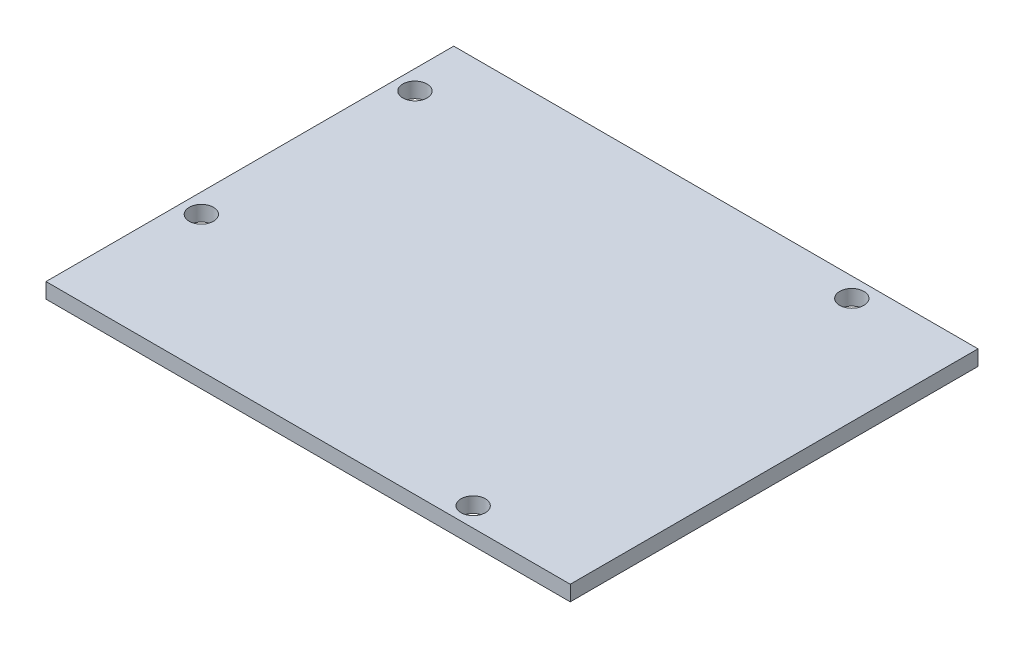
ISO-10303-21;
HEADER;
FILE_DESCRIPTION(('STEP AP214'),'2;1');
FILE_NAME('part.step','',(''),(''),'','','');
FILE_SCHEMA(('AUTOMOTIVE_DESIGN { 1 0 10303 214 1 1 1 1 }'));
ENDSEC;
DATA;
#1=APPLICATION_CONTEXT('core data for automotive mechanical design processes');
#2=APPLICATION_PROTOCOL_DEFINITION('international standard','automotive_design',2000,#1);
#3=PRODUCT_CONTEXT('',#1,'mechanical');
#4=PRODUCT('Part','Part','',(#3));
#5=PRODUCT_RELATED_PRODUCT_CATEGORY('part','',(#4));
#6=PRODUCT_DEFINITION_FORMATION('','',#4);
#7=PRODUCT_DEFINITION_CONTEXT('part definition',#1,'design');
#8=PRODUCT_DEFINITION('design','',#6,#7);
#9=PRODUCT_DEFINITION_SHAPE('','',#8);
#10=(LENGTH_UNIT() NAMED_UNIT(*) SI_UNIT(.MILLI.,.METRE.));
#11=(NAMED_UNIT(*) PLANE_ANGLE_UNIT() SI_UNIT($,.RADIAN.));
#12=(NAMED_UNIT(*) SI_UNIT($,.STERADIAN.) SOLID_ANGLE_UNIT());
#13=UNCERTAINTY_MEASURE_WITH_UNIT(LENGTH_MEASURE(1.E-05),#10,'distance_accuracy_value','');
#14=(GEOMETRIC_REPRESENTATION_CONTEXT(3) GLOBAL_UNCERTAINTY_ASSIGNED_CONTEXT((#13)) GLOBAL_UNIT_ASSIGNED_CONTEXT((#10,
#11,#12)) REPRESENTATION_CONTEXT('',''));
#15=CARTESIAN_POINT('',(0.,0.,0.));
#16=DIRECTION('',(0.,0.,1.));
#17=DIRECTION('',(1.,0.,0.));
#18=AXIS2_PLACEMENT_3D('',#15,#16,#17);
#19=CARTESIAN_POINT('',(0.,2.,0.));
#20=DIRECTION('',(0.,1.,0.));
#21=DIRECTION('',(0.,0.,1.));
#22=AXIS2_PLACEMENT_3D('',#19,#20,#21);
#23=PLANE('',#22);
#24=CARTESIAN_POINT('',(52.8104629581221,2.,-2.39173328178488));
#25=DIRECTION('',(0.,1.,0.));
#26=DIRECTION('',(0.,0.,1.));
#27=AXIS2_PLACEMENT_3D('',#24,#25,#26);
#28=CIRCLE('',#27,1.5875);
#29=CARTESIAN_POINT('',(52.8104629581221,2.,-0.80423328178488));
#30=VERTEX_POINT('',#29);
#31=EDGE_CURVE('E125',#30,#30,#28,.T.);
#32=ORIENTED_EDGE('',*,*,#31,.F.);
#33=EDGE_LOOP('',(#32));
#34=FACE_BOUND('',#33,.T.);
#35=CARTESIAN_POINT('',(2.01046295812209,2.,-17.6317332817849));
#36=DIRECTION('',(0.,1.,0.));
#37=DIRECTION('',(0.,0.,1.));
#38=AXIS2_PLACEMENT_3D('',#35,#36,#37);
#39=CIRCLE('',#38,1.5875);
#40=CARTESIAN_POINT('',(2.01046295812209,2.,-16.0442332817849));
#41=VERTEX_POINT('',#40);
#42=EDGE_CURVE('E104',#41,#41,#39,.T.);
#43=ORIENTED_EDGE('',*,*,#42,.F.);
#44=EDGE_LOOP('',(#43));
#45=FACE_BOUND('',#44,.T.);
#46=DIRECTION('',(0.,0.,1.));
#47=VECTOR('',#46,1.);
#48=CARTESIAN_POINT('',(-0.529537041877912,2.,-53.1917332817849));
#49=LINE('',#48,#47);
#50=CARTESIAN_POINT('',(-0.529537041877912,2.,-53.1917332817849));
#51=VERTEX_POINT('',#50);
#52=CARTESIAN_POINT('',(-0.529537041877906,2.,0.148266718215121));
#53=VERTEX_POINT('',#52);
#54=EDGE_CURVE('E89',#51,#53,#49,.T.);
#55=ORIENTED_EDGE('',*,*,#54,.T.);
#56=DIRECTION('',(1.,0.,0.));
#57=VECTOR('',#56,1.);
#58=CARTESIAN_POINT('',(-0.529537041877906,2.,0.148266718215121));
#59=LINE('',#58,#57);
#60=CARTESIAN_POINT('',(68.0504629581221,2.,0.148266718215121));
#61=VERTEX_POINT('',#60);
#62=EDGE_CURVE('E84',#53,#61,#59,.T.);
#63=ORIENTED_EDGE('',*,*,#62,.T.);
#64=DIRECTION('',(0.,0.,-1.));
#65=VECTOR('',#64,1.);
#66=CARTESIAN_POINT('',(68.0504629581221,2.,-53.1917332817849));
#67=LINE('',#66,#65);
#68=CARTESIAN_POINT('',(68.0504629581221,2.,-53.1917332817849));
#69=VERTEX_POINT('',#68);
#70=EDGE_CURVE('E87',#61,#69,#67,.T.);
#71=ORIENTED_EDGE('',*,*,#70,.T.);
#72=DIRECTION('',(-1.,0.,0.));
#73=VECTOR('',#72,1.);
#74=CARTESIAN_POINT('',(-0.529537041877912,2.,-53.1917332817849));
#75=LINE('',#74,#73);
#76=EDGE_CURVE('E54',#69,#51,#75,.T.);
#77=ORIENTED_EDGE('',*,*,#76,.T.);
#78=EDGE_LOOP('',(#55,#63,#71,#77));
#79=FACE_BOUND('',#78,.T.);
#80=CARTESIAN_POINT('',(2.01046295812209,2.,-45.5717332817849));
#81=DIRECTION('',(0.,1.,0.));
#82=DIRECTION('',(0.,0.,1.));
#83=AXIS2_PLACEMENT_3D('',#80,#81,#82);
#84=CIRCLE('',#83,1.5875);
#85=CARTESIAN_POINT('',(2.01046295812209,2.,-43.9842332817849));
#86=VERTEX_POINT('',#85);
#87=EDGE_CURVE('E119',#86,#86,#84,.T.);
#88=ORIENTED_EDGE('',*,*,#87,.F.);
#89=EDGE_LOOP('',(#88));
#90=FACE_BOUND('',#89,.T.);
#91=CARTESIAN_POINT('',(54.0804629581221,2.,-50.6517332817849));
#92=DIRECTION('',(0.,1.,0.));
#93=DIRECTION('',(0.,0.,1.));
#94=AXIS2_PLACEMENT_3D('',#91,#92,#93);
#95=CIRCLE('',#94,1.5875);
#96=CARTESIAN_POINT('',(54.0804629581221,2.,-49.0642332817849));
#97=VERTEX_POINT('',#96);
#98=EDGE_CURVE('E131',#97,#97,#95,.T.);
#99=ORIENTED_EDGE('',*,*,#98,.F.);
#100=EDGE_LOOP('',(#99));
#101=FACE_BOUND('',#100,.T.);
#102=ADVANCED_FACE('F37',(#34,#45,#79,#90,#101),#23,.T.);
#103=CARTESIAN_POINT('',(0.,0.,0.));
#104=DIRECTION('',(0.,1.,0.));
#105=DIRECTION('',(0.,0.,1.));
#106=AXIS2_PLACEMENT_3D('',#103,#104,#105);
#107=PLANE('',#106);
#108=DIRECTION('',(0.,0.,1.));
#109=VECTOR('',#108,1.);
#110=CARTESIAN_POINT('',(-0.529537041877912,0.,-53.1917332817849));
#111=LINE('',#110,#109);
#112=CARTESIAN_POINT('',(-0.529537041877912,0.,-53.1917332817849));
#113=VERTEX_POINT('',#112);
#114=CARTESIAN_POINT('',(-0.529537041877906,0.,0.148266718215121));
#115=VERTEX_POINT('',#114);
#116=EDGE_CURVE('E101',#113,#115,#111,.T.);
#117=ORIENTED_EDGE('',*,*,#116,.F.);
#118=DIRECTION('',(-1.,0.,0.));
#119=VECTOR('',#118,1.);
#120=CARTESIAN_POINT('',(-0.529537041877912,0.,-53.1917332817849));
#121=LINE('',#120,#119);
#122=CARTESIAN_POINT('',(68.0504629581221,0.,-53.1917332817849));
#123=VERTEX_POINT('',#122);
#124=EDGE_CURVE('E77',#123,#113,#121,.T.);
#125=ORIENTED_EDGE('',*,*,#124,.F.);
#126=DIRECTION('',(0.,0.,-1.));
#127=VECTOR('',#126,1.);
#128=CARTESIAN_POINT('',(68.0504629581221,0.,-53.1917332817849));
#129=LINE('',#128,#127);
#130=CARTESIAN_POINT('',(68.0504629581221,0.,0.148266718215121));
#131=VERTEX_POINT('',#130);
#132=EDGE_CURVE('E71',#131,#123,#129,.T.);
#133=ORIENTED_EDGE('',*,*,#132,.F.);
#134=DIRECTION('',(1.,0.,0.));
#135=VECTOR('',#134,1.);
#136=CARTESIAN_POINT('',(-0.529537041877906,0.,0.148266718215121));
#137=LINE('',#136,#135);
#138=EDGE_CURVE('E93',#115,#131,#137,.T.);
#139=ORIENTED_EDGE('',*,*,#138,.F.);
#140=EDGE_LOOP('',(#117,#125,#133,#139));
#141=FACE_BOUND('',#140,.T.);
#142=CARTESIAN_POINT('',(2.01046295812209,0.,-17.6317332817849));
#143=DIRECTION('',(0.,1.,0.));
#144=DIRECTION('',(0.,0.,1.));
#145=AXIS2_PLACEMENT_3D('',#142,#143,#144);
#146=CIRCLE('',#145,1.5875);
#147=CARTESIAN_POINT('',(2.01046295812209,0.,-16.0442332817849));
#148=VERTEX_POINT('',#147);
#149=EDGE_CURVE('E116',#148,#148,#146,.T.);
#150=ORIENTED_EDGE('',*,*,#149,.T.);
#151=EDGE_LOOP('',(#150));
#152=FACE_BOUND('',#151,.T.);
#153=CARTESIAN_POINT('',(2.01046295812209,0.,-45.5717332817849));
#154=DIRECTION('',(0.,1.,0.));
#155=DIRECTION('',(0.,0.,1.));
#156=AXIS2_PLACEMENT_3D('',#153,#154,#155);
#157=CIRCLE('',#156,1.5875);
#158=CARTESIAN_POINT('',(2.01046295812209,0.,-43.9842332817849));
#159=VERTEX_POINT('',#158);
#160=EDGE_CURVE('E122',#159,#159,#157,.T.);
#161=ORIENTED_EDGE('',*,*,#160,.T.);
#162=EDGE_LOOP('',(#161));
#163=FACE_BOUND('',#162,.T.);
#164=CARTESIAN_POINT('',(52.8104629581221,0.,-2.39173328178488));
#165=DIRECTION('',(0.,1.,0.));
#166=DIRECTION('',(0.,0.,1.));
#167=AXIS2_PLACEMENT_3D('',#164,#165,#166);
#168=CIRCLE('',#167,1.5875);
#169=CARTESIAN_POINT('',(52.8104629581221,0.,-0.80423328178488));
#170=VERTEX_POINT('',#169);
#171=EDGE_CURVE('E128',#170,#170,#168,.T.);
#172=ORIENTED_EDGE('',*,*,#171,.T.);
#173=EDGE_LOOP('',(#172));
#174=FACE_BOUND('',#173,.T.);
#175=CARTESIAN_POINT('',(54.0804629581221,0.,-50.6517332817849));
#176=DIRECTION('',(0.,1.,0.));
#177=DIRECTION('',(0.,0.,1.));
#178=AXIS2_PLACEMENT_3D('',#175,#176,#177);
#179=CIRCLE('',#178,1.5875);
#180=CARTESIAN_POINT('',(54.0804629581221,0.,-49.0642332817849));
#181=VERTEX_POINT('',#180);
#182=EDGE_CURVE('E134',#181,#181,#179,.T.);
#183=ORIENTED_EDGE('',*,*,#182,.T.);
#184=EDGE_LOOP('',(#183));
#185=FACE_BOUND('',#184,.T.);
#186=ADVANCED_FACE('F112',(#141,#152,#163,#174,#185),#107,.F.);
#187=CARTESIAN_POINT('',(-0.529537041877912,2.,-53.1917332817849));
#188=DIRECTION('',(1.,0.,0.));
#189=DIRECTION('',(0.,0.,-1.));
#190=AXIS2_PLACEMENT_3D('',#187,#188,#189);
#191=PLANE('',#190);
#192=ORIENTED_EDGE('',*,*,#116,.T.);
#193=DIRECTION('',(0.,-1.,0.));
#194=VECTOR('',#193,1.);
#195=CARTESIAN_POINT('',(-0.529537041877906,2.,0.148266718215121));
#196=LINE('',#195,#194);
#197=EDGE_CURVE('E11',#53,#115,#196,.T.);
#198=ORIENTED_EDGE('',*,*,#197,.F.);
#199=ORIENTED_EDGE('',*,*,#54,.F.);
#200=DIRECTION('',(0.,-1.,0.));
#201=VECTOR('',#200,1.);
#202=CARTESIAN_POINT('',(-0.529537041877912,2.,-53.1917332817849));
#203=LINE('',#202,#201);
#204=EDGE_CURVE('E97',#51,#113,#203,.T.);
#205=ORIENTED_EDGE('',*,*,#204,.T.);
#206=EDGE_LOOP('',(#192,#198,#199,#205));
#207=FACE_BOUND('',#206,.T.);
#208=ADVANCED_FACE('F39',(#207),#191,.F.);
#209=CARTESIAN_POINT('',(-0.529537041877906,2.,0.148266718215121));
#210=DIRECTION('',(0.,0.,-1.));
#211=DIRECTION('',(-1.,0.,0.));
#212=AXIS2_PLACEMENT_3D('',#209,#210,#211);
#213=PLANE('',#212);
#214=ORIENTED_EDGE('',*,*,#138,.T.);
#215=DIRECTION('',(0.,-1.,0.));
#216=VECTOR('',#215,1.);
#217=CARTESIAN_POINT('',(68.0504629581221,2.,0.148266718215121));
#218=LINE('',#217,#216);
#219=EDGE_CURVE('E46',#61,#131,#218,.T.);
#220=ORIENTED_EDGE('',*,*,#219,.F.);
#221=ORIENTED_EDGE('',*,*,#62,.F.);
#222=ORIENTED_EDGE('',*,*,#197,.T.);
#223=EDGE_LOOP('',(#214,#220,#221,#222));
#224=FACE_BOUND('',#223,.T.);
#225=ADVANCED_FACE('F92',(#224),#213,.F.);
#226=CARTESIAN_POINT('',(68.0504629581221,2.,-53.1917332817849));
#227=DIRECTION('',(-1.,0.,0.));
#228=DIRECTION('',(0.,0.,1.));
#229=AXIS2_PLACEMENT_3D('',#226,#227,#228);
#230=PLANE('',#229);
#231=ORIENTED_EDGE('',*,*,#132,.T.);
#232=DIRECTION('',(0.,-1.,0.));
#233=VECTOR('',#232,1.);
#234=CARTESIAN_POINT('',(68.0504629581221,2.,-53.1917332817849));
#235=LINE('',#234,#233);
#236=EDGE_CURVE('E94',#69,#123,#235,.T.);
#237=ORIENTED_EDGE('',*,*,#236,.F.);
#238=ORIENTED_EDGE('',*,*,#70,.F.);
#239=ORIENTED_EDGE('',*,*,#219,.T.);
#240=EDGE_LOOP('',(#231,#237,#238,#239));
#241=FACE_BOUND('',#240,.T.);
#242=ADVANCED_FACE('F95',(#241),#230,.F.);
#243=CARTESIAN_POINT('',(-0.529537041877912,2.,-53.1917332817849));
#244=DIRECTION('',(0.,0.,1.));
#245=DIRECTION('',(1.,0.,0.));
#246=AXIS2_PLACEMENT_3D('',#243,#244,#245);
#247=PLANE('',#246);
#248=ORIENTED_EDGE('',*,*,#124,.T.);
#249=ORIENTED_EDGE('',*,*,#204,.F.);
#250=ORIENTED_EDGE('',*,*,#76,.F.);
#251=ORIENTED_EDGE('',*,*,#236,.T.);
#252=EDGE_LOOP('',(#248,#249,#250,#251));
#253=FACE_BOUND('',#252,.T.);
#254=ADVANCED_FACE('F109',(#253),#247,.F.);
#255=CARTESIAN_POINT('',(2.01046295812209,2.,-17.6317332817849));
#256=DIRECTION('',(0.,-1.,0.));
#257=DIRECTION('',(0.,0.,-1.));
#258=AXIS2_PLACEMENT_3D('',#255,#256,#257);
#259=CYLINDRICAL_SURFACE('',#258,1.5875);
#260=ORIENTED_EDGE('',*,*,#42,.T.);
#261=EDGE_LOOP('',(#260));
#262=FACE_BOUND('',#261,.T.);
#263=ORIENTED_EDGE('',*,*,#149,.F.);
#264=EDGE_LOOP('',(#263));
#265=FACE_BOUND('',#264,.T.);
#266=ADVANCED_FACE('F153',(#262,#265),#259,.F.);
#267=CARTESIAN_POINT('',(2.01046295812209,2.,-45.5717332817849));
#268=DIRECTION('',(0.,-1.,0.));
#269=DIRECTION('',(0.,0.,-1.));
#270=AXIS2_PLACEMENT_3D('',#267,#268,#269);
#271=CYLINDRICAL_SURFACE('',#270,1.5875);
#272=ORIENTED_EDGE('',*,*,#87,.T.);
#273=EDGE_LOOP('',(#272));
#274=FACE_BOUND('',#273,.T.);
#275=ORIENTED_EDGE('',*,*,#160,.F.);
#276=EDGE_LOOP('',(#275));
#277=FACE_BOUND('',#276,.T.);
#278=ADVANCED_FACE('F199',(#274,#277),#271,.F.);
#279=CARTESIAN_POINT('',(52.8104629581221,2.,-2.39173328178488));
#280=DIRECTION('',(0.,-1.,0.));
#281=DIRECTION('',(0.,0.,-1.));
#282=AXIS2_PLACEMENT_3D('',#279,#280,#281);
#283=CYLINDRICAL_SURFACE('',#282,1.5875);
#284=ORIENTED_EDGE('',*,*,#31,.T.);
#285=EDGE_LOOP('',(#284));
#286=FACE_BOUND('',#285,.T.);
#287=ORIENTED_EDGE('',*,*,#171,.F.);
#288=EDGE_LOOP('',(#287));
#289=FACE_BOUND('',#288,.T.);
#290=ADVANCED_FACE('F207',(#286,#289),#283,.F.);
#291=CARTESIAN_POINT('',(54.0804629581221,2.,-50.6517332817849));
#292=DIRECTION('',(0.,-1.,0.));
#293=DIRECTION('',(0.,0.,-1.));
#294=AXIS2_PLACEMENT_3D('',#291,#292,#293);
#295=CYLINDRICAL_SURFACE('',#294,1.5875);
#296=ORIENTED_EDGE('',*,*,#98,.T.);
#297=EDGE_LOOP('',(#296));
#298=FACE_BOUND('',#297,.T.);
#299=ORIENTED_EDGE('',*,*,#182,.F.);
#300=EDGE_LOOP('',(#299));
#301=FACE_BOUND('',#300,.T.);
#302=ADVANCED_FACE('F140',(#298,#301),#295,.F.);
#303=CLOSED_SHELL('',(#102,#186,#208,#225,#242,#254,#266,#278,#290,#302));
#304=MANIFOLD_SOLID_BREP('B2',#303);
#305=ADVANCED_BREP_SHAPE_REPRESENTATION('',(#18,#304),#14);
#306=SHAPE_DEFINITION_REPRESENTATION(#9,#305);
ENDSEC;
END-ISO-10303-21;
